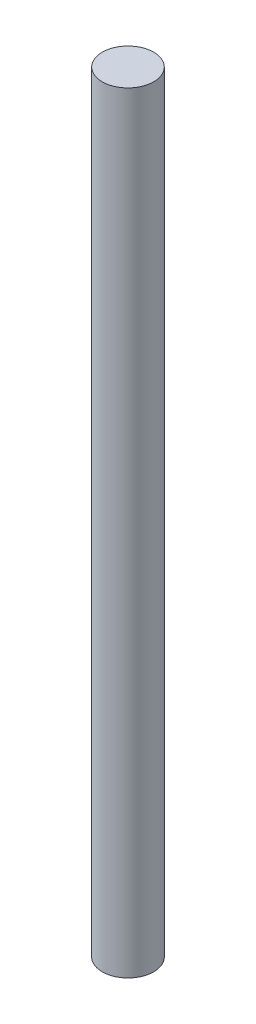
ISO-10303-21;
HEADER;
FILE_DESCRIPTION(('STEP AP214'),'2;1');
FILE_NAME('part.step','',(''),(''),'','','');
FILE_SCHEMA(('AUTOMOTIVE_DESIGN { 1 0 10303 214 1 1 1 1 }'));
ENDSEC;
DATA;
#1=APPLICATION_CONTEXT('core data for automotive mechanical design processes');
#2=APPLICATION_PROTOCOL_DEFINITION('international standard','automotive_design',2000,#1);
#3=PRODUCT_CONTEXT('',#1,'mechanical');
#4=PRODUCT('Part','Part','',(#3));
#5=PRODUCT_RELATED_PRODUCT_CATEGORY('part','',(#4));
#6=PRODUCT_DEFINITION_FORMATION('','',#4);
#7=PRODUCT_DEFINITION_CONTEXT('part definition',#1,'design');
#8=PRODUCT_DEFINITION('design','',#6,#7);
#9=PRODUCT_DEFINITION_SHAPE('','',#8);
#10=(LENGTH_UNIT() NAMED_UNIT(*) SI_UNIT(.MILLI.,.METRE.));
#11=(NAMED_UNIT(*) PLANE_ANGLE_UNIT() SI_UNIT($,.RADIAN.));
#12=(NAMED_UNIT(*) SI_UNIT($,.STERADIAN.) SOLID_ANGLE_UNIT());
#13=UNCERTAINTY_MEASURE_WITH_UNIT(LENGTH_MEASURE(1.E-05),#10,'distance_accuracy_value','');
#14=(GEOMETRIC_REPRESENTATION_CONTEXT(3) GLOBAL_UNCERTAINTY_ASSIGNED_CONTEXT((#13)) GLOBAL_UNIT_ASSIGNED_CONTEXT((#10,
#11,#12)) REPRESENTATION_CONTEXT('',''));
#15=CARTESIAN_POINT('',(0.,0.,0.));
#16=DIRECTION('',(0.,0.,1.));
#17=DIRECTION('',(1.,0.,0.));
#18=AXIS2_PLACEMENT_3D('',#15,#16,#17);
#19=CARTESIAN_POINT('',(0.,30.,0.));
#20=DIRECTION('',(0.,-1.,0.));
#21=DIRECTION('',(0.,0.,-1.));
#22=AXIS2_PLACEMENT_3D('',#19,#20,#21);
#23=CYLINDRICAL_SURFACE('',#22,1.);
#24=CARTESIAN_POINT('',(0.,30.,0.));
#25=DIRECTION('',(0.,1.,0.));
#26=DIRECTION('',(0.,0.,1.));
#27=AXIS2_PLACEMENT_3D('',#24,#25,#26);
#28=CIRCLE('',#27,1.);
#29=CARTESIAN_POINT('',(0.,30.,1.));
#30=VERTEX_POINT('',#29);
#31=EDGE_CURVE('E10',#30,#30,#28,.T.);
#32=ORIENTED_EDGE('',*,*,#31,.F.);
#33=EDGE_LOOP('',(#32));
#34=FACE_BOUND('',#33,.T.);
#35=CARTESIAN_POINT('',(0.,0.,0.));
#36=DIRECTION('',(0.,1.,0.));
#37=DIRECTION('',(0.,0.,1.));
#38=AXIS2_PLACEMENT_3D('',#35,#36,#37);
#39=CIRCLE('',#38,1.);
#40=CARTESIAN_POINT('',(0.,0.,1.));
#41=VERTEX_POINT('',#40);
#42=EDGE_CURVE('E34',#41,#41,#39,.T.);
#43=ORIENTED_EDGE('',*,*,#42,.T.);
#44=EDGE_LOOP('',(#43));
#45=FACE_BOUND('',#44,.T.);
#46=ADVANCED_FACE('F31',(#34,#45),#23,.T.);
#47=CARTESIAN_POINT('',(0.,30.,0.));
#48=DIRECTION('',(0.,1.,0.));
#49=DIRECTION('',(0.,0.,1.));
#50=AXIS2_PLACEMENT_3D('',#47,#48,#49);
#51=PLANE('',#50);
#52=ORIENTED_EDGE('',*,*,#31,.T.);
#53=EDGE_LOOP('',(#52));
#54=FACE_BOUND('',#53,.T.);
#55=ADVANCED_FACE('F46',(#54),#51,.T.);
#56=CARTESIAN_POINT('',(0.,0.,0.));
#57=DIRECTION('',(0.,1.,0.));
#58=DIRECTION('',(0.,0.,1.));
#59=AXIS2_PLACEMENT_3D('',#56,#57,#58);
#60=PLANE('',#59);
#61=ORIENTED_EDGE('',*,*,#42,.F.);
#62=EDGE_LOOP('',(#61));
#63=FACE_BOUND('',#62,.T.);
#64=ADVANCED_FACE('F44',(#63),#60,.F.);
#65=CLOSED_SHELL('',(#46,#55,#64));
#66=MANIFOLD_SOLID_BREP('B2',#65);
#67=ADVANCED_BREP_SHAPE_REPRESENTATION('',(#18,#66),#14);
#68=SHAPE_DEFINITION_REPRESENTATION(#9,#67);
ENDSEC;
END-ISO-10303-21;
